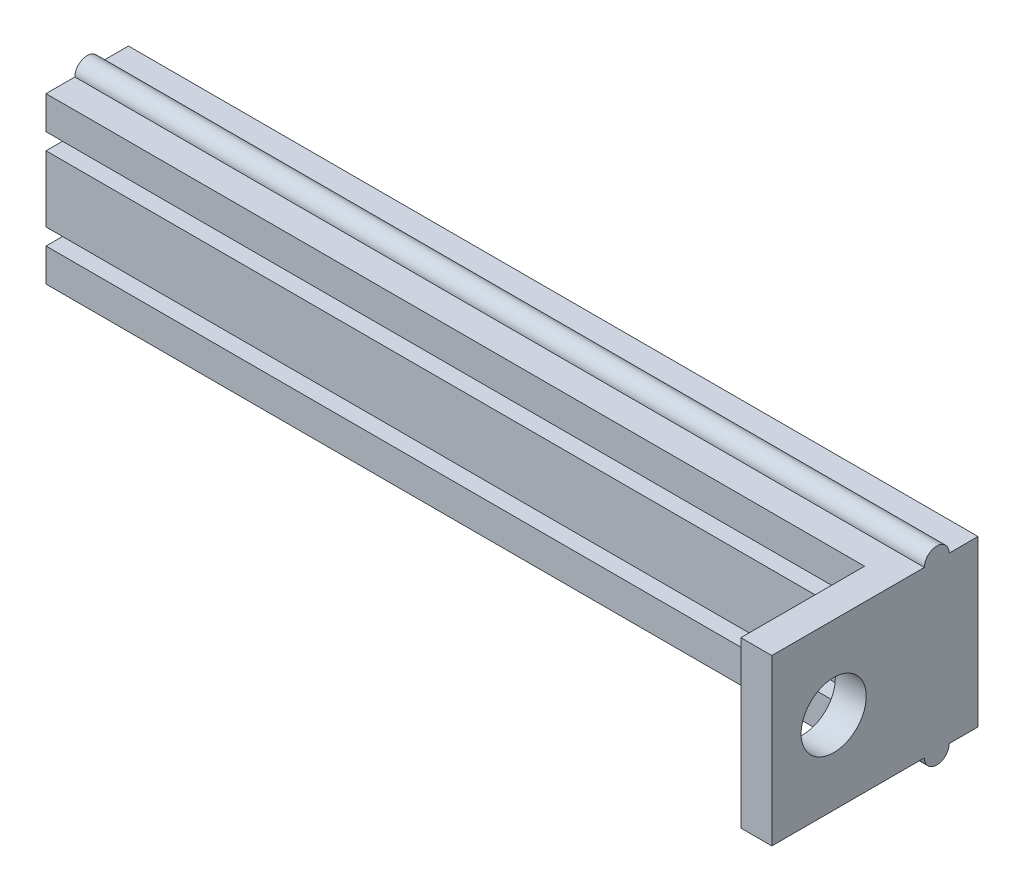
ISO-10303-21;
HEADER;
FILE_DESCRIPTION(('STEP AP214'),'2;1');
FILE_NAME('part.step','',(''),(''),'','','');
FILE_SCHEMA(('AUTOMOTIVE_DESIGN { 1 0 10303 214 1 1 1 1 }'));
ENDSEC;
DATA;
#1=APPLICATION_CONTEXT('core data for automotive mechanical design processes');
#2=APPLICATION_PROTOCOL_DEFINITION('international standard','automotive_design',2000,#1);
#3=PRODUCT_CONTEXT('',#1,'mechanical');
#4=PRODUCT('Part','Part','',(#3));
#5=PRODUCT_RELATED_PRODUCT_CATEGORY('part','',(#4));
#6=PRODUCT_DEFINITION_FORMATION('','',#4);
#7=PRODUCT_DEFINITION_CONTEXT('part definition',#1,'design');
#8=PRODUCT_DEFINITION('design','',#6,#7);
#9=PRODUCT_DEFINITION_SHAPE('','',#8);
#10=(LENGTH_UNIT() NAMED_UNIT(*) SI_UNIT(.MILLI.,.METRE.));
#11=(NAMED_UNIT(*) PLANE_ANGLE_UNIT() SI_UNIT($,.RADIAN.));
#12=(NAMED_UNIT(*) SI_UNIT($,.STERADIAN.) SOLID_ANGLE_UNIT());
#13=UNCERTAINTY_MEASURE_WITH_UNIT(LENGTH_MEASURE(1.E-05),#10,'distance_accuracy_value','');
#14=(GEOMETRIC_REPRESENTATION_CONTEXT(3) GLOBAL_UNCERTAINTY_ASSIGNED_CONTEXT((#13)) GLOBAL_UNIT_ASSIGNED_CONTEXT((#10,
#11,#12)) REPRESENTATION_CONTEXT('',''));
#15=CARTESIAN_POINT('',(0.,0.,0.));
#16=DIRECTION('',(0.,0.,1.));
#17=DIRECTION('',(1.,0.,0.));
#18=AXIS2_PLACEMENT_3D('',#15,#16,#17);
#19=CARTESIAN_POINT('',(0.,0.,20.));
#20=DIRECTION('',(0.,0.,1.));
#21=DIRECTION('',(1.,0.,0.));
#22=AXIS2_PLACEMENT_3D('',#19,#20,#21);
#23=PLANE('',#22);
#24=DIRECTION('',(0.,-1.,0.));
#25=VECTOR('',#24,1.);
#26=CARTESIAN_POINT('',(95.1247723132969,68.6666666666667,20.));
#27=LINE('',#26,#25);
#28=CARTESIAN_POINT('',(95.1247723132969,56.6666666666666,20.));
#29=VERTEX_POINT('',#28);
#30=CARTESIAN_POINT('',(95.124772313297,40.6666666666666,20.));
#31=VERTEX_POINT('',#30);
#32=EDGE_CURVE('E430',#29,#31,#27,.T.);
#33=ORIENTED_EDGE('',*,*,#32,.F.);
#34=DIRECTION('',(-1.,0.,0.));
#35=VECTOR('',#34,1.);
#36=CARTESIAN_POINT('',(95.124772313297,56.6666666666666,20.));
#37=LINE('',#36,#35);
#38=CARTESIAN_POINT('',(-103.375227686703,56.6666666666667,20.));
#39=VERTEX_POINT('',#38);
#40=EDGE_CURVE('E293',#29,#39,#37,.T.);
#41=ORIENTED_EDGE('',*,*,#40,.T.);
#42=DIRECTION('',(0.,-1.,0.));
#43=VECTOR('',#42,1.);
#44=CARTESIAN_POINT('',(-103.375227686703,68.6666666666667,20.));
#45=LINE('',#44,#43);
#46=CARTESIAN_POINT('',(-103.375227686703,40.6666666666667,20.));
#47=VERTEX_POINT('',#46);
#48=EDGE_CURVE('E444',#39,#47,#45,.T.);
#49=ORIENTED_EDGE('',*,*,#48,.T.);
#50=DIRECTION('',(-1.,0.,0.));
#51=VECTOR('',#50,1.);
#52=CARTESIAN_POINT('',(95.124772313297,40.6666666666666,20.));
#53=LINE('',#52,#51);
#54=EDGE_CURVE('E375',#31,#47,#53,.T.);
#55=ORIENTED_EDGE('',*,*,#54,.F.);
#56=EDGE_LOOP('',(#33,#41,#49,#55));
#57=FACE_BOUND('',#56,.T.);
#58=ADVANCED_FACE('F42',(#57),#23,.T.);
#59=CARTESIAN_POINT('',(95.124772313297,36.6666666666666,20.));
#60=VERTEX_POINT('',#59);
#61=CARTESIAN_POINT('',(95.124772313297,28.6666666666666,20.));
#62=VERTEX_POINT('',#61);
#63=EDGE_CURVE('E409',#60,#62,#27,.T.);
#64=ORIENTED_EDGE('',*,*,#63,.F.);
#65=DIRECTION('',(-1.,0.,0.));
#66=VECTOR('',#65,1.);
#67=CARTESIAN_POINT('',(95.124772313297,36.6666666666666,20.));
#68=LINE('',#67,#66);
#69=CARTESIAN_POINT('',(-103.375227686703,36.6666666666666,20.));
#70=VERTEX_POINT('',#69);
#71=EDGE_CURVE('E378',#60,#70,#68,.T.);
#72=ORIENTED_EDGE('',*,*,#71,.T.);
#73=CARTESIAN_POINT('',(-103.375227686703,28.6666666666666,20.));
#74=VERTEX_POINT('',#73);
#75=EDGE_CURVE('E445',#70,#74,#45,.T.);
#76=ORIENTED_EDGE('',*,*,#75,.T.);
#77=DIRECTION('',(1.,0.,0.));
#78=VECTOR('',#77,1.);
#79=CARTESIAN_POINT('',(-103.375227686703,28.6666666666666,20.));
#80=LINE('',#79,#78);
#81=EDGE_CURVE('E443',#74,#62,#80,.T.);
#82=ORIENTED_EDGE('',*,*,#81,.T.);
#83=EDGE_LOOP('',(#64,#72,#76,#82));
#84=FACE_BOUND('',#83,.T.);
#85=ADVANCED_FACE('F515',(#84),#23,.T.);
#86=CARTESIAN_POINT('',(-103.375227686703,68.6666666666667,20.));
#87=DIRECTION('',(0.,-1.,0.));
#88=DIRECTION('',(0.,0.,-1.));
#89=AXIS2_PLACEMENT_3D('',#86,#87,#88);
#90=PLANE('',#89);
#91=DIRECTION('',(0.,0.,-1.));
#92=VECTOR('',#91,1.);
#93=CARTESIAN_POINT('',(102.624772313297,68.6666666666667,20.));
#94=LINE('',#93,#92);
#95=CARTESIAN_POINT('',(102.624772313297,68.6666666666667,50.));
#96=VERTEX_POINT('',#95);
#97=CARTESIAN_POINT('',(102.624772313297,68.6666666666666,13.));
#98=VERTEX_POINT('',#97);
#99=EDGE_CURVE('E473',#96,#98,#94,.T.);
#100=ORIENTED_EDGE('',*,*,#99,.T.);
#101=DIRECTION('',(-1.,0.,0.));
#102=VECTOR('',#101,1.);
#103=CARTESIAN_POINT('',(102.624772313297,68.6666666666666,13.));
#104=LINE('',#103,#102);
#105=CARTESIAN_POINT('',(-103.375227686703,68.6666666666667,13.));
#106=VERTEX_POINT('',#105);
#107=EDGE_CURVE('E289',#98,#106,#104,.T.);
#108=ORIENTED_EDGE('',*,*,#107,.T.);
#109=DIRECTION('',(0.,0.,-1.));
#110=VECTOR('',#109,1.);
#111=CARTESIAN_POINT('',(-103.375227686703,68.6666666666667,20.));
#112=LINE('',#111,#110);
#113=CARTESIAN_POINT('',(-103.375227686703,68.6666666666667,20.));
#114=VERTEX_POINT('',#113);
#115=EDGE_CURVE('E468',#114,#106,#112,.T.);
#116=ORIENTED_EDGE('',*,*,#115,.F.);
#117=DIRECTION('',(-1.,0.,0.));
#118=VECTOR('',#117,1.);
#119=CARTESIAN_POINT('',(-103.375227686703,68.6666666666667,20.));
#120=LINE('',#119,#118);
#121=CARTESIAN_POINT('',(95.1247723132969,68.6666666666667,20.));
#122=VERTEX_POINT('',#121);
#123=EDGE_CURVE('E449',#122,#114,#120,.T.);
#124=ORIENTED_EDGE('',*,*,#123,.F.);
#125=DIRECTION('',(0.,0.,-1.));
#126=VECTOR('',#125,1.);
#127=CARTESIAN_POINT('',(95.1247723132969,68.6666666666667,50.));
#128=LINE('',#127,#126);
#129=CARTESIAN_POINT('',(95.1247723132969,68.6666666666667,50.));
#130=VERTEX_POINT('',#129);
#131=EDGE_CURVE('E434',#130,#122,#128,.T.);
#132=ORIENTED_EDGE('',*,*,#131,.F.);
#133=DIRECTION('',(-1.,0.,0.));
#134=VECTOR('',#133,1.);
#135=CARTESIAN_POINT('',(102.624772313297,68.6666666666667,50.));
#136=LINE('',#135,#134);
#137=EDGE_CURVE('E416',#96,#130,#136,.T.);
#138=ORIENTED_EDGE('',*,*,#137,.F.);
#139=EDGE_LOOP('',(#100,#108,#116,#124,#132,#138));
#140=FACE_BOUND('',#139,.T.);
#141=ADVANCED_FACE('F526',(#140),#90,.F.);
#142=CARTESIAN_POINT('',(-103.375227686703,28.6666666666666,20.));
#143=DIRECTION('',(0.,1.,0.));
#144=DIRECTION('',(0.,0.,1.));
#145=AXIS2_PLACEMENT_3D('',#142,#143,#144);
#146=PLANE('',#145);
#147=DIRECTION('',(0.,0.,-1.));
#148=VECTOR('',#147,1.);
#149=CARTESIAN_POINT('',(102.624772313297,28.6666666666666,20.));
#150=LINE('',#149,#148);
#151=CARTESIAN_POINT('',(102.624772313297,28.6666666666666,7.));
#152=VERTEX_POINT('',#151);
#153=CARTESIAN_POINT('',(102.624772313297,28.6666666666666,0.));
#154=VERTEX_POINT('',#153);
#155=EDGE_CURVE('E476',#152,#154,#150,.T.);
#156=ORIENTED_EDGE('',*,*,#155,.F.);
#157=DIRECTION('',(-1.,0.,0.));
#158=VECTOR('',#157,1.);
#159=CARTESIAN_POINT('',(102.624772313297,28.6666666666666,7.));
#160=LINE('',#159,#158);
#161=CARTESIAN_POINT('',(-103.375227686703,28.6666666666666,7.));
#162=VERTEX_POINT('',#161);
#163=EDGE_CURVE('E405',#152,#162,#160,.T.);
#164=ORIENTED_EDGE('',*,*,#163,.T.);
#165=DIRECTION('',(0.,0.,-1.));
#166=VECTOR('',#165,1.);
#167=CARTESIAN_POINT('',(-103.375227686703,28.6666666666666,20.));
#168=LINE('',#167,#166);
#169=CARTESIAN_POINT('',(-103.375227686703,28.6666666666666,0.));
#170=VERTEX_POINT('',#169);
#171=EDGE_CURVE('E51',#162,#170,#168,.T.);
#172=ORIENTED_EDGE('',*,*,#171,.T.);
#173=DIRECTION('',(1.,0.,0.));
#174=VECTOR('',#173,1.);
#175=CARTESIAN_POINT('',(-103.375227686703,28.6666666666666,0.));
#176=LINE('',#175,#174);
#177=EDGE_CURVE('E456',#170,#154,#176,.T.);
#178=ORIENTED_EDGE('',*,*,#177,.T.);
#179=EDGE_LOOP('',(#156,#164,#172,#178));
#180=FACE_BOUND('',#179,.T.);
#181=ADVANCED_FACE('F492',(#180),#146,.F.);
#182=CARTESIAN_POINT('',(-103.375227686703,68.6666666666667,20.));
#183=DIRECTION('',(1.,0.,0.));
#184=DIRECTION('',(0.,1.,0.));
#185=AXIS2_PLACEMENT_3D('',#182,#183,#184);
#186=PLANE('',#185);
#187=DIRECTION('',(0.,-1.,0.));
#188=VECTOR('',#187,1.);
#189=CARTESIAN_POINT('',(-103.375227686703,0.,15.));
#190=LINE('',#189,#188);
#191=CARTESIAN_POINT('',(-103.375227686703,63.6666666666667,15.));
#192=VERTEX_POINT('',#191);
#193=CARTESIAN_POINT('',(-103.375227686703,60.6666666666666,15.));
#194=VERTEX_POINT('',#193);
#195=EDGE_CURVE('E233',#192,#194,#190,.T.);
#196=ORIENTED_EDGE('',*,*,#195,.T.);
#197=DIRECTION('',(0.,0.,-1.));
#198=VECTOR('',#197,1.);
#199=CARTESIAN_POINT('',(-103.375227686703,60.6666666666666,0.));
#200=LINE('',#199,#198);
#201=CARTESIAN_POINT('',(-103.375227686703,60.6666666666666,20.));
#202=VERTEX_POINT('',#201);
#203=EDGE_CURVE('E242',#202,#194,#200,.T.);
#204=ORIENTED_EDGE('',*,*,#203,.F.);
#205=EDGE_CURVE('E439',#114,#202,#45,.T.);
#206=ORIENTED_EDGE('',*,*,#205,.F.);
#207=ORIENTED_EDGE('',*,*,#115,.T.);
#208=CARTESIAN_POINT('',(-103.375227686703,68.6666666666667,10.));
#209=DIRECTION('',(-1.,0.,0.));
#210=DIRECTION('',(0.,-1.,0.));
#211=AXIS2_PLACEMENT_3D('',#208,#209,#210);
#212=CIRCLE('',#211,3.);
#213=CARTESIAN_POINT('',(-103.375227686703,68.6666666666667,7.));
#214=VERTEX_POINT('',#213);
#215=EDGE_CURVE('E392',#106,#214,#212,.T.);
#216=ORIENTED_EDGE('',*,*,#215,.T.);
#217=CARTESIAN_POINT('',(-103.375227686703,68.6666666666667,0.));
#218=VERTEX_POINT('',#217);
#219=EDGE_CURVE('E452',#214,#218,#112,.T.);
#220=ORIENTED_EDGE('',*,*,#219,.T.);
#221=DIRECTION('',(0.,-1.,0.));
#222=VECTOR('',#221,1.);
#223=CARTESIAN_POINT('',(-103.375227686703,68.6666666666667,0.));
#224=LINE('',#223,#222);
#225=EDGE_CURVE('E438',#218,#170,#224,.T.);
#226=ORIENTED_EDGE('',*,*,#225,.T.);
#227=ORIENTED_EDGE('',*,*,#171,.F.);
#228=CARTESIAN_POINT('',(-103.375227686703,28.6666666666666,10.));
#229=DIRECTION('',(-1.,0.,0.));
#230=DIRECTION('',(0.,-1.,0.));
#231=AXIS2_PLACEMENT_3D('',#228,#229,#230);
#232=CIRCLE('',#231,3.);
#233=CARTESIAN_POINT('',(-103.375227686703,28.6666666666666,13.));
#234=VERTEX_POINT('',#233);
#235=EDGE_CURVE('E395',#162,#234,#232,.T.);
#236=ORIENTED_EDGE('',*,*,#235,.T.);
#237=EDGE_CURVE('E11',#74,#234,#168,.T.);
#238=ORIENTED_EDGE('',*,*,#237,.F.);
#239=ORIENTED_EDGE('',*,*,#75,.F.);
#240=DIRECTION('',(0.,0.,-1.));
#241=VECTOR('',#240,1.);
#242=CARTESIAN_POINT('',(-103.375227686703,36.6666666666666,0.));
#243=LINE('',#242,#241);
#244=CARTESIAN_POINT('',(-103.375227686703,36.6666666666666,15.));
#245=VERTEX_POINT('',#244);
#246=EDGE_CURVE('E337',#70,#245,#243,.T.);
#247=ORIENTED_EDGE('',*,*,#246,.T.);
#248=DIRECTION('',(0.,-1.,0.));
#249=VECTOR('',#248,1.);
#250=CARTESIAN_POINT('',(-103.375227686703,0.,15.));
#251=LINE('',#250,#249);
#252=CARTESIAN_POINT('',(-103.375227686703,33.6666666666667,15.));
#253=VERTEX_POINT('',#252);
#254=EDGE_CURVE('E333',#245,#253,#251,.T.);
#255=ORIENTED_EDGE('',*,*,#254,.T.);
#256=DIRECTION('',(0.,0.,1.));
#257=VECTOR('',#256,1.);
#258=CARTESIAN_POINT('',(-103.375227686703,33.6666666666667,0.));
#259=LINE('',#258,#257);
#260=CARTESIAN_POINT('',(-103.375227686703,33.6666666666667,10.));
#261=VERTEX_POINT('',#260);
#262=EDGE_CURVE('E311',#261,#253,#259,.T.);
#263=ORIENTED_EDGE('',*,*,#262,.F.);
#264=DIRECTION('',(0.,-1.,0.));
#265=VECTOR('',#264,1.);
#266=CARTESIAN_POINT('',(-103.375227686703,0.,10.));
#267=LINE('',#266,#265);
#268=CARTESIAN_POINT('',(-103.375227686703,43.6666666666667,10.));
#269=VERTEX_POINT('',#268);
#270=EDGE_CURVE('E354',#269,#261,#267,.T.);
#271=ORIENTED_EDGE('',*,*,#270,.F.);
#272=DIRECTION('',(0.,0.,1.));
#273=VECTOR('',#272,1.);
#274=CARTESIAN_POINT('',(-103.375227686703,43.6666666666667,0.));
#275=LINE('',#274,#273);
#276=CARTESIAN_POINT('',(-103.375227686703,43.6666666666667,15.));
#277=VERTEX_POINT('',#276);
#278=EDGE_CURVE('E350',#269,#277,#275,.T.);
#279=ORIENTED_EDGE('',*,*,#278,.T.);
#280=DIRECTION('',(0.,-1.,0.));
#281=VECTOR('',#280,1.);
#282=CARTESIAN_POINT('',(-103.375227686703,0.,15.));
#283=LINE('',#282,#281);
#284=CARTESIAN_POINT('',(-103.375227686703,40.6666666666667,15.));
#285=VERTEX_POINT('',#284);
#286=EDGE_CURVE('E346',#277,#285,#283,.T.);
#287=ORIENTED_EDGE('',*,*,#286,.T.);
#288=DIRECTION('',(0.,0.,-1.));
#289=VECTOR('',#288,1.);
#290=CARTESIAN_POINT('',(-103.375227686703,40.6666666666667,0.));
#291=LINE('',#290,#289);
#292=EDGE_CURVE('E342',#47,#285,#291,.T.);
#293=ORIENTED_EDGE('',*,*,#292,.F.);
#294=ORIENTED_EDGE('',*,*,#48,.F.);
#295=DIRECTION('',(0.,0.,-1.));
#296=VECTOR('',#295,1.);
#297=CARTESIAN_POINT('',(-103.375227686703,56.6666666666667,0.));
#298=LINE('',#297,#296);
#299=CARTESIAN_POINT('',(-103.375227686703,56.6666666666667,15.));
#300=VERTEX_POINT('',#299);
#301=EDGE_CURVE('E246',#39,#300,#298,.T.);
#302=ORIENTED_EDGE('',*,*,#301,.T.);
#303=DIRECTION('',(0.,-1.,0.));
#304=VECTOR('',#303,1.);
#305=CARTESIAN_POINT('',(-103.375227686703,0.,15.));
#306=LINE('',#305,#304);
#307=CARTESIAN_POINT('',(-103.375227686703,53.6666666666666,15.));
#308=VERTEX_POINT('',#307);
#309=EDGE_CURVE('E279',#300,#308,#306,.T.);
#310=ORIENTED_EDGE('',*,*,#309,.T.);
#311=DIRECTION('',(0.,0.,1.));
#312=VECTOR('',#311,1.);
#313=CARTESIAN_POINT('',(-103.375227686703,53.6666666666666,0.));
#314=LINE('',#313,#312);
#315=CARTESIAN_POINT('',(-103.375227686703,53.6666666666666,10.));
#316=VERTEX_POINT('',#315);
#317=EDGE_CURVE('E275',#316,#308,#314,.T.);
#318=ORIENTED_EDGE('',*,*,#317,.F.);
#319=DIRECTION('',(0.,-1.,0.));
#320=VECTOR('',#319,1.);
#321=CARTESIAN_POINT('',(-103.375227686703,0.,10.));
#322=LINE('',#321,#320);
#323=CARTESIAN_POINT('',(-103.375227686703,63.6666666666667,10.));
#324=VERTEX_POINT('',#323);
#325=EDGE_CURVE('E271',#324,#316,#322,.T.);
#326=ORIENTED_EDGE('',*,*,#325,.F.);
#327=DIRECTION('',(0.,0.,1.));
#328=VECTOR('',#327,1.);
#329=CARTESIAN_POINT('',(-103.375227686703,63.6666666666667,0.));
#330=LINE('',#329,#328);
#331=EDGE_CURVE('E267',#324,#192,#330,.T.);
#332=ORIENTED_EDGE('',*,*,#331,.T.);
#333=EDGE_LOOP('',(#196,#204,#206,#207,#216,#220,#226,#227,#236,#238,#239,#247,#255,#263,#271,
#279,#287,#293,#294,#302,#310,#318,#326,#332));
#334=FACE_BOUND('',#333,.T.);
#335=ADVANCED_FACE('F44',(#334),#186,.F.);
#336=ORIENTED_EDGE('',*,*,#237,.T.);
#337=DIRECTION('',(-1.,0.,0.));
#338=VECTOR('',#337,1.);
#339=CARTESIAN_POINT('',(102.624772313297,28.6666666666666,13.));
#340=LINE('',#339,#338);
#341=CARTESIAN_POINT('',(102.624772313297,28.6666666666666,13.));
#342=VERTEX_POINT('',#341);
#343=EDGE_CURVE('E401',#342,#234,#340,.T.);
#344=ORIENTED_EDGE('',*,*,#343,.F.);
#345=CARTESIAN_POINT('',(102.624772313297,28.6666666666666,50.));
#346=VERTEX_POINT('',#345);
#347=EDGE_CURVE('E477',#346,#342,#150,.T.);
#348=ORIENTED_EDGE('',*,*,#347,.F.);
#349=DIRECTION('',(1.,0.,0.));
#350=VECTOR('',#349,1.);
#351=CARTESIAN_POINT('',(102.624772313297,28.6666666666666,50.));
#352=LINE('',#351,#350);
#353=CARTESIAN_POINT('',(95.124772313297,28.6666666666666,50.));
#354=VERTEX_POINT('',#353);
#355=EDGE_CURVE('E423',#354,#346,#352,.T.);
#356=ORIENTED_EDGE('',*,*,#355,.F.);
#357=DIRECTION('',(0.,0.,-1.));
#358=VECTOR('',#357,1.);
#359=CARTESIAN_POINT('',(95.124772313297,28.6666666666666,50.));
#360=LINE('',#359,#358);
#361=EDGE_CURVE('E427',#354,#62,#360,.T.);
#362=ORIENTED_EDGE('',*,*,#361,.T.);
#363=ORIENTED_EDGE('',*,*,#81,.F.);
#364=EDGE_LOOP('',(#336,#344,#348,#356,#362,#363));
#365=FACE_BOUND('',#364,.T.);
#366=ADVANCED_FACE('F519',(#365),#146,.F.);
#367=CARTESIAN_POINT('',(102.624772313297,68.6666666666667,20.));
#368=DIRECTION('',(-1.,0.,0.));
#369=DIRECTION('',(0.,-1.,0.));
#370=AXIS2_PLACEMENT_3D('',#367,#368,#369);
#371=PLANE('',#370);
#372=CARTESIAN_POINT('',(102.624772313297,48.6666666666666,35.));
#373=DIRECTION('',(-1.,0.,0.));
#374=DIRECTION('',(0.,-1.,0.));
#375=AXIS2_PLACEMENT_3D('',#372,#373,#374);
#376=CIRCLE('',#375,7.9);
#377=CARTESIAN_POINT('',(102.624772313297,40.7666666666666,35.));
#378=VERTEX_POINT('',#377);
#379=EDGE_CURVE('E338',#378,#378,#376,.T.);
#380=ORIENTED_EDGE('',*,*,#379,.T.);
#381=EDGE_LOOP('',(#380));
#382=FACE_BOUND('',#381,.T.);
#383=DIRECTION('',(0.,1.,0.));
#384=VECTOR('',#383,1.);
#385=CARTESIAN_POINT('',(102.624772313297,68.6666666666667,0.));
#386=LINE('',#385,#384);
#387=CARTESIAN_POINT('',(102.624772313297,68.6666666666667,0.));
#388=VERTEX_POINT('',#387);
#389=EDGE_CURVE('E460',#154,#388,#386,.T.);
#390=ORIENTED_EDGE('',*,*,#389,.T.);
#391=CARTESIAN_POINT('',(102.624772313297,68.6666666666666,7.));
#392=VERTEX_POINT('',#391);
#393=EDGE_CURVE('E472',#392,#388,#94,.T.);
#394=ORIENTED_EDGE('',*,*,#393,.F.);
#395=CARTESIAN_POINT('',(102.624772313297,68.6666666666666,10.));
#396=DIRECTION('',(-1.,0.,0.));
#397=DIRECTION('',(0.,-1.,0.));
#398=AXIS2_PLACEMENT_3D('',#395,#396,#397);
#399=CIRCLE('',#398,3.);
#400=EDGE_CURVE('E388',#98,#392,#399,.T.);
#401=ORIENTED_EDGE('',*,*,#400,.F.);
#402=ORIENTED_EDGE('',*,*,#99,.F.);
#403=DIRECTION('',(0.,1.,0.));
#404=VECTOR('',#403,1.);
#405=CARTESIAN_POINT('',(102.624772313297,68.6666666666667,50.));
#406=LINE('',#405,#404);
#407=EDGE_CURVE('E412',#346,#96,#406,.T.);
#408=ORIENTED_EDGE('',*,*,#407,.F.);
#409=ORIENTED_EDGE('',*,*,#347,.T.);
#410=CARTESIAN_POINT('',(102.624772313297,28.6666666666666,10.));
#411=DIRECTION('',(-1.,0.,0.));
#412=DIRECTION('',(0.,-1.,0.));
#413=AXIS2_PLACEMENT_3D('',#410,#411,#412);
#414=CIRCLE('',#413,3.);
#415=EDGE_CURVE('E398',#152,#342,#414,.T.);
#416=ORIENTED_EDGE('',*,*,#415,.F.);
#417=ORIENTED_EDGE('',*,*,#155,.T.);
#418=EDGE_LOOP('',(#390,#394,#401,#402,#408,#409,#416,#417));
#419=FACE_BOUND('',#418,.T.);
#420=ADVANCED_FACE('F485',(#382,#419),#371,.F.);
#421=ORIENTED_EDGE('',*,*,#219,.F.);
#422=DIRECTION('',(-1.,0.,0.));
#423=VECTOR('',#422,1.);
#424=CARTESIAN_POINT('',(102.624772313297,68.6666666666666,7.));
#425=LINE('',#424,#423);
#426=EDGE_CURVE('E384',#392,#214,#425,.T.);
#427=ORIENTED_EDGE('',*,*,#426,.F.);
#428=ORIENTED_EDGE('',*,*,#393,.T.);
#429=DIRECTION('',(-1.,0.,0.));
#430=VECTOR('',#429,1.);
#431=CARTESIAN_POINT('',(-103.375227686703,68.6666666666667,0.));
#432=LINE('',#431,#430);
#433=EDGE_CURVE('E464',#388,#218,#432,.T.);
#434=ORIENTED_EDGE('',*,*,#433,.T.);
#435=EDGE_LOOP('',(#421,#427,#428,#434));
#436=FACE_BOUND('',#435,.T.);
#437=ADVANCED_FACE('F499',(#436),#90,.F.);
#438=DIRECTION('',(-1.,0.,0.));
#439=VECTOR('',#438,1.);
#440=CARTESIAN_POINT('',(95.124772313297,60.6666666666666,20.));
#441=LINE('',#440,#439);
#442=CARTESIAN_POINT('',(95.124772313297,60.6666666666666,20.));
#443=VERTEX_POINT('',#442);
#444=EDGE_CURVE('E290',#443,#202,#441,.T.);
#445=ORIENTED_EDGE('',*,*,#444,.F.);
#446=EDGE_CURVE('E417',#122,#443,#27,.T.);
#447=ORIENTED_EDGE('',*,*,#446,.F.);
#448=ORIENTED_EDGE('',*,*,#123,.T.);
#449=ORIENTED_EDGE('',*,*,#205,.T.);
#450=EDGE_LOOP('',(#445,#447,#448,#449));
#451=FACE_BOUND('',#450,.T.);
#452=ADVANCED_FACE('F531',(#451),#23,.T.);
#453=CARTESIAN_POINT('',(0.,0.,0.));
#454=DIRECTION('',(0.,0.,1.));
#455=DIRECTION('',(1.,0.,0.));
#456=AXIS2_PLACEMENT_3D('',#453,#454,#455);
#457=PLANE('',#456);
#458=ORIENTED_EDGE('',*,*,#225,.F.);
#459=ORIENTED_EDGE('',*,*,#433,.F.);
#460=ORIENTED_EDGE('',*,*,#389,.F.);
#461=ORIENTED_EDGE('',*,*,#177,.F.);
#462=EDGE_LOOP('',(#458,#459,#460,#461));
#463=FACE_BOUND('',#462,.T.);
#464=ADVANCED_FACE('F496',(#463),#457,.F.);
#465=CARTESIAN_POINT('',(95.1247723132969,68.6666666666667,50.));
#466=DIRECTION('',(1.,0.,0.));
#467=DIRECTION('',(0.,1.,0.));
#468=AXIS2_PLACEMENT_3D('',#465,#466,#467);
#469=PLANE('',#468);
#470=CARTESIAN_POINT('',(95.124772313297,48.6666666666666,35.));
#471=DIRECTION('',(-1.,0.,0.));
#472=DIRECTION('',(0.,-1.,0.));
#473=AXIS2_PLACEMENT_3D('',#470,#471,#472);
#474=CIRCLE('',#473,7.9);
#475=CARTESIAN_POINT('',(95.124772313297,40.7666666666666,35.));
#476=VERTEX_POINT('',#475);
#477=EDGE_CURVE('E249',#476,#476,#474,.T.);
#478=ORIENTED_EDGE('',*,*,#477,.F.);
#479=EDGE_LOOP('',(#478));
#480=FACE_BOUND('',#479,.T.);
#481=ORIENTED_EDGE('',*,*,#446,.T.);
#482=DIRECTION('',(0.,0.,-1.));
#483=VECTOR('',#482,1.);
#484=CARTESIAN_POINT('',(95.124772313297,60.6666666666666,0.));
#485=LINE('',#484,#483);
#486=CARTESIAN_POINT('',(95.124772313297,60.6666666666666,15.));
#487=VERTEX_POINT('',#486);
#488=EDGE_CURVE('E236',#443,#487,#485,.T.);
#489=ORIENTED_EDGE('',*,*,#488,.T.);
#490=DIRECTION('',(0.,-1.,0.));
#491=VECTOR('',#490,1.);
#492=CARTESIAN_POINT('',(95.1247723132969,0.,15.));
#493=LINE('',#492,#491);
#494=CARTESIAN_POINT('',(95.124772313297,63.6666666666666,15.));
#495=VERTEX_POINT('',#494);
#496=EDGE_CURVE('E227',#495,#487,#493,.T.);
#497=ORIENTED_EDGE('',*,*,#496,.F.);
#498=DIRECTION('',(0.,0.,1.));
#499=VECTOR('',#498,1.);
#500=CARTESIAN_POINT('',(95.124772313297,63.6666666666666,0.));
#501=LINE('',#500,#499);
#502=CARTESIAN_POINT('',(95.124772313297,63.6666666666666,10.));
#503=VERTEX_POINT('',#502);
#504=EDGE_CURVE('E215',#503,#495,#501,.T.);
#505=ORIENTED_EDGE('',*,*,#504,.F.);
#506=DIRECTION('',(0.,-1.,0.));
#507=VECTOR('',#506,1.);
#508=CARTESIAN_POINT('',(95.1247723132969,0.,10.));
#509=LINE('',#508,#507);
#510=CARTESIAN_POINT('',(95.124772313297,53.6666666666666,10.));
#511=VERTEX_POINT('',#510);
#512=EDGE_CURVE('E226',#503,#511,#509,.T.);
#513=ORIENTED_EDGE('',*,*,#512,.T.);
#514=DIRECTION('',(0.,0.,1.));
#515=VECTOR('',#514,1.);
#516=CARTESIAN_POINT('',(95.124772313297,53.6666666666666,0.));
#517=LINE('',#516,#515);
#518=CARTESIAN_POINT('',(95.124772313297,53.6666666666666,15.));
#519=VERTEX_POINT('',#518);
#520=EDGE_CURVE('E254',#511,#519,#517,.T.);
#521=ORIENTED_EDGE('',*,*,#520,.T.);
#522=DIRECTION('',(0.,-1.,0.));
#523=VECTOR('',#522,1.);
#524=CARTESIAN_POINT('',(95.1247723132969,0.,15.));
#525=LINE('',#524,#523);
#526=CARTESIAN_POINT('',(95.124772313297,56.6666666666666,15.));
#527=VERTEX_POINT('',#526);
#528=EDGE_CURVE('E258',#527,#519,#525,.T.);
#529=ORIENTED_EDGE('',*,*,#528,.F.);
#530=DIRECTION('',(0.,0.,-1.));
#531=VECTOR('',#530,1.);
#532=CARTESIAN_POINT('',(95.124772313297,56.6666666666666,0.));
#533=LINE('',#532,#531);
#534=EDGE_CURVE('E65',#29,#527,#533,.T.);
#535=ORIENTED_EDGE('',*,*,#534,.F.);
#536=ORIENTED_EDGE('',*,*,#32,.T.);
#537=DIRECTION('',(0.,0.,-1.));
#538=VECTOR('',#537,1.);
#539=CARTESIAN_POINT('',(95.124772313297,40.6666666666666,0.));
#540=LINE('',#539,#538);
#541=CARTESIAN_POINT('',(95.124772313297,40.6666666666666,15.));
#542=VERTEX_POINT('',#541);
#543=EDGE_CURVE('E314',#31,#542,#540,.T.);
#544=ORIENTED_EDGE('',*,*,#543,.T.);
#545=DIRECTION('',(0.,-1.,0.));
#546=VECTOR('',#545,1.);
#547=CARTESIAN_POINT('',(95.1247723132969,0.,15.));
#548=LINE('',#547,#546);
#549=CARTESIAN_POINT('',(95.124772313297,43.6666666666666,15.));
#550=VERTEX_POINT('',#549);
#551=EDGE_CURVE('E318',#550,#542,#548,.T.);
#552=ORIENTED_EDGE('',*,*,#551,.F.);
#553=DIRECTION('',(0.,0.,1.));
#554=VECTOR('',#553,1.);
#555=CARTESIAN_POINT('',(95.124772313297,43.6666666666666,0.));
#556=LINE('',#555,#554);
#557=CARTESIAN_POINT('',(95.124772313297,43.6666666666666,10.));
#558=VERTEX_POINT('',#557);
#559=EDGE_CURVE('E321',#558,#550,#556,.T.);
#560=ORIENTED_EDGE('',*,*,#559,.F.);
#561=DIRECTION('',(0.,-1.,0.));
#562=VECTOR('',#561,1.);
#563=CARTESIAN_POINT('',(95.1247723132969,0.,10.));
#564=LINE('',#563,#562);
#565=CARTESIAN_POINT('',(95.124772313297,33.6666666666666,10.));
#566=VERTEX_POINT('',#565);
#567=EDGE_CURVE('E324',#558,#566,#564,.T.);
#568=ORIENTED_EDGE('',*,*,#567,.T.);
#569=DIRECTION('',(0.,0.,1.));
#570=VECTOR('',#569,1.);
#571=CARTESIAN_POINT('',(95.124772313297,33.6666666666666,0.));
#572=LINE('',#571,#570);
#573=CARTESIAN_POINT('',(95.124772313297,33.6666666666666,15.));
#574=VERTEX_POINT('',#573);
#575=EDGE_CURVE('E328',#566,#574,#572,.T.);
#576=ORIENTED_EDGE('',*,*,#575,.T.);
#577=DIRECTION('',(0.,-1.,0.));
#578=VECTOR('',#577,1.);
#579=CARTESIAN_POINT('',(95.1247723132969,0.,15.));
#580=LINE('',#579,#578);
#581=CARTESIAN_POINT('',(95.124772313297,36.6666666666666,15.));
#582=VERTEX_POINT('',#581);
#583=EDGE_CURVE('E308',#582,#574,#580,.T.);
#584=ORIENTED_EDGE('',*,*,#583,.F.);
#585=DIRECTION('',(0.,0.,-1.));
#586=VECTOR('',#585,1.);
#587=CARTESIAN_POINT('',(95.124772313297,36.6666666666666,0.));
#588=LINE('',#587,#586);
#589=EDGE_CURVE('E58',#60,#582,#588,.T.);
#590=ORIENTED_EDGE('',*,*,#589,.F.);
#591=ORIENTED_EDGE('',*,*,#63,.T.);
#592=ORIENTED_EDGE('',*,*,#361,.F.);
#593=DIRECTION('',(0.,-1.,0.));
#594=VECTOR('',#593,1.);
#595=CARTESIAN_POINT('',(95.1247723132969,68.6666666666667,50.));
#596=LINE('',#595,#594);
#597=EDGE_CURVE('E420',#130,#354,#596,.T.);
#598=ORIENTED_EDGE('',*,*,#597,.F.);
#599=ORIENTED_EDGE('',*,*,#131,.T.);
#600=EDGE_LOOP('',(#481,#489,#497,#505,#513,#521,#529,#535,#536,#544,#552,#560,#568,#576,#584,
#590,#591,#592,#598,#599));
#601=FACE_BOUND('',#600,.T.);
#602=ADVANCED_FACE('F240',(#480,#601),#469,.F.);
#603=CARTESIAN_POINT('',(0.,0.,50.));
#604=DIRECTION('',(0.,0.,-1.));
#605=DIRECTION('',(-1.,0.,0.));
#606=AXIS2_PLACEMENT_3D('',#603,#604,#605);
#607=PLANE('',#606);
#608=ORIENTED_EDGE('',*,*,#407,.T.);
#609=ORIENTED_EDGE('',*,*,#137,.T.);
#610=ORIENTED_EDGE('',*,*,#597,.T.);
#611=ORIENTED_EDGE('',*,*,#355,.T.);
#612=EDGE_LOOP('',(#608,#609,#610,#611));
#613=FACE_BOUND('',#612,.T.);
#614=ADVANCED_FACE('F522',(#613),#607,.F.);
#615=CARTESIAN_POINT('',(102.624772313297,28.6666666666666,10.));
#616=DIRECTION('',(-1.,0.,0.));
#617=DIRECTION('',(0.,-1.,0.));
#618=AXIS2_PLACEMENT_3D('',#615,#616,#617);
#619=CYLINDRICAL_SURFACE('',#618,3.);
#620=ORIENTED_EDGE('',*,*,#235,.F.);
#621=ORIENTED_EDGE('',*,*,#163,.F.);
#622=ORIENTED_EDGE('',*,*,#415,.T.);
#623=ORIENTED_EDGE('',*,*,#343,.T.);
#624=EDGE_LOOP('',(#620,#621,#622,#623));
#625=FACE_BOUND('',#624,.T.);
#626=ADVANCED_FACE('F584',(#625),#619,.T.);
#627=CARTESIAN_POINT('',(102.624772313297,68.6666666666666,10.));
#628=DIRECTION('',(-1.,0.,0.));
#629=DIRECTION('',(0.,-1.,0.));
#630=AXIS2_PLACEMENT_3D('',#627,#628,#629);
#631=CYLINDRICAL_SURFACE('',#630,3.);
#632=ORIENTED_EDGE('',*,*,#215,.F.);
#633=ORIENTED_EDGE('',*,*,#107,.F.);
#634=ORIENTED_EDGE('',*,*,#400,.T.);
#635=ORIENTED_EDGE('',*,*,#426,.T.);
#636=EDGE_LOOP('',(#632,#633,#634,#635));
#637=FACE_BOUND('',#636,.T.);
#638=ADVANCED_FACE('F586',(#637),#631,.T.);
#639=CARTESIAN_POINT('',(95.1247723132969,0.,15.));
#640=DIRECTION('',(0.,0.,-1.));
#641=DIRECTION('',(-1.,0.,0.));
#642=AXIS2_PLACEMENT_3D('',#639,#640,#641);
#643=PLANE('',#642);
#644=ORIENTED_EDGE('',*,*,#254,.F.);
#645=DIRECTION('',(-1.,0.,0.));
#646=VECTOR('',#645,1.);
#647=CARTESIAN_POINT('',(95.124772313297,36.6666666666666,15.));
#648=LINE('',#647,#646);
#649=EDGE_CURVE('E332',#582,#245,#648,.T.);
#650=ORIENTED_EDGE('',*,*,#649,.F.);
#651=ORIENTED_EDGE('',*,*,#583,.T.);
#652=DIRECTION('',(-1.,0.,0.));
#653=VECTOR('',#652,1.);
#654=CARTESIAN_POINT('',(95.124772313297,33.6666666666666,15.));
#655=LINE('',#654,#653);
#656=EDGE_CURVE('E268',#574,#253,#655,.T.);
#657=ORIENTED_EDGE('',*,*,#656,.T.);
#658=EDGE_LOOP('',(#644,#650,#651,#657));
#659=FACE_BOUND('',#658,.T.);
#660=ADVANCED_FACE('F580',(#659),#643,.T.);
#661=CARTESIAN_POINT('',(95.124772313297,33.6666666666666,0.));
#662=DIRECTION('',(0.,-1.,0.));
#663=DIRECTION('',(1.,0.,0.));
#664=AXIS2_PLACEMENT_3D('',#661,#662,#663);
#665=PLANE('',#664);
#666=ORIENTED_EDGE('',*,*,#262,.T.);
#667=ORIENTED_EDGE('',*,*,#656,.F.);
#668=ORIENTED_EDGE('',*,*,#575,.F.);
#669=DIRECTION('',(-1.,0.,0.));
#670=VECTOR('',#669,1.);
#671=CARTESIAN_POINT('',(95.124772313297,33.6666666666666,10.));
#672=LINE('',#671,#670);
#673=EDGE_CURVE('E363',#566,#261,#672,.T.);
#674=ORIENTED_EDGE('',*,*,#673,.T.);
#675=EDGE_LOOP('',(#666,#667,#668,#674));
#676=FACE_BOUND('',#675,.T.);
#677=ADVANCED_FACE('F575',(#676),#665,.F.);
#678=CARTESIAN_POINT('',(95.1247723132969,0.,10.));
#679=DIRECTION('',(0.,0.,-1.));
#680=DIRECTION('',(0.,1.,0.));
#681=AXIS2_PLACEMENT_3D('',#678,#679,#680);
#682=PLANE('',#681);
#683=ORIENTED_EDGE('',*,*,#270,.T.);
#684=ORIENTED_EDGE('',*,*,#673,.F.);
#685=ORIENTED_EDGE('',*,*,#567,.F.);
#686=DIRECTION('',(-1.,0.,0.));
#687=VECTOR('',#686,1.);
#688=CARTESIAN_POINT('',(95.124772313297,43.6666666666666,10.));
#689=LINE('',#688,#687);
#690=EDGE_CURVE('E366',#558,#269,#689,.T.);
#691=ORIENTED_EDGE('',*,*,#690,.T.);
#692=EDGE_LOOP('',(#683,#684,#685,#691));
#693=FACE_BOUND('',#692,.T.);
#694=ADVANCED_FACE('F572',(#693),#682,.F.);
#695=CARTESIAN_POINT('',(95.124772313297,43.6666666666666,0.));
#696=DIRECTION('',(0.,-1.,0.));
#697=DIRECTION('',(1.,0.,0.));
#698=AXIS2_PLACEMENT_3D('',#695,#696,#697);
#699=PLANE('',#698);
#700=ORIENTED_EDGE('',*,*,#278,.F.);
#701=ORIENTED_EDGE('',*,*,#690,.F.);
#702=ORIENTED_EDGE('',*,*,#559,.T.);
#703=DIRECTION('',(-1.,0.,0.));
#704=VECTOR('',#703,1.);
#705=CARTESIAN_POINT('',(95.124772313297,43.6666666666666,15.));
#706=LINE('',#705,#704);
#707=EDGE_CURVE('E369',#550,#277,#706,.T.);
#708=ORIENTED_EDGE('',*,*,#707,.T.);
#709=EDGE_LOOP('',(#700,#701,#702,#708));
#710=FACE_BOUND('',#709,.T.);
#711=ADVANCED_FACE('F567',(#710),#699,.T.);
#712=CARTESIAN_POINT('',(95.1247723132969,0.,15.));
#713=DIRECTION('',(0.,0.,-1.));
#714=DIRECTION('',(-1.,0.,0.));
#715=AXIS2_PLACEMENT_3D('',#712,#713,#714);
#716=PLANE('',#715);
#717=ORIENTED_EDGE('',*,*,#286,.F.);
#718=ORIENTED_EDGE('',*,*,#707,.F.);
#719=ORIENTED_EDGE('',*,*,#551,.T.);
#720=DIRECTION('',(-1.,0.,0.));
#721=VECTOR('',#720,1.);
#722=CARTESIAN_POINT('',(95.124772313297,40.6666666666666,15.));
#723=LINE('',#722,#721);
#724=EDGE_CURVE('E372',#542,#285,#723,.T.);
#725=ORIENTED_EDGE('',*,*,#724,.T.);
#726=EDGE_LOOP('',(#717,#718,#719,#725));
#727=FACE_BOUND('',#726,.T.);
#728=ADVANCED_FACE('F563',(#727),#716,.T.);
#729=CARTESIAN_POINT('',(95.124772313297,40.6666666666666,0.));
#730=DIRECTION('',(0.,1.,0.));
#731=DIRECTION('',(-1.,0.,0.));
#732=AXIS2_PLACEMENT_3D('',#729,#730,#731);
#733=PLANE('',#732);
#734=ORIENTED_EDGE('',*,*,#292,.T.);
#735=ORIENTED_EDGE('',*,*,#724,.F.);
#736=ORIENTED_EDGE('',*,*,#543,.F.);
#737=ORIENTED_EDGE('',*,*,#54,.T.);
#738=EDGE_LOOP('',(#734,#735,#736,#737));
#739=FACE_BOUND('',#738,.T.);
#740=ADVANCED_FACE('F559',(#739),#733,.F.);
#741=CARTESIAN_POINT('',(95.124772313297,36.6666666666666,0.));
#742=DIRECTION('',(0.,1.,0.));
#743=DIRECTION('',(-1.,0.,0.));
#744=AXIS2_PLACEMENT_3D('',#741,#742,#743);
#745=PLANE('',#744);
#746=ORIENTED_EDGE('',*,*,#246,.F.);
#747=ORIENTED_EDGE('',*,*,#71,.F.);
#748=ORIENTED_EDGE('',*,*,#589,.T.);
#749=ORIENTED_EDGE('',*,*,#649,.T.);
#750=EDGE_LOOP('',(#746,#747,#748,#749));
#751=FACE_BOUND('',#750,.T.);
#752=ADVANCED_FACE('F582',(#751),#745,.T.);
#753=CARTESIAN_POINT('',(95.1247723132969,0.,15.));
#754=DIRECTION('',(0.,0.,-1.));
#755=DIRECTION('',(-1.,0.,0.));
#756=AXIS2_PLACEMENT_3D('',#753,#754,#755);
#757=PLANE('',#756);
#758=ORIENTED_EDGE('',*,*,#195,.F.);
#759=DIRECTION('',(-1.,0.,0.));
#760=VECTOR('',#759,1.);
#761=CARTESIAN_POINT('',(95.124772313297,63.6666666666666,15.));
#762=LINE('',#761,#760);
#763=EDGE_CURVE('E219',#495,#192,#762,.T.);
#764=ORIENTED_EDGE('',*,*,#763,.F.);
#765=ORIENTED_EDGE('',*,*,#496,.T.);
#766=DIRECTION('',(-1.,0.,0.));
#767=VECTOR('',#766,1.);
#768=CARTESIAN_POINT('',(95.124772313297,60.6666666666666,15.));
#769=LINE('',#768,#767);
#770=EDGE_CURVE('E286',#487,#194,#769,.T.);
#771=ORIENTED_EDGE('',*,*,#770,.T.);
#772=EDGE_LOOP('',(#758,#764,#765,#771));
#773=FACE_BOUND('',#772,.T.);
#774=ADVANCED_FACE('F230',(#773),#757,.T.);
#775=CARTESIAN_POINT('',(95.124772313297,60.6666666666666,0.));
#776=DIRECTION('',(0.,1.,0.));
#777=DIRECTION('',(-1.,0.,0.));
#778=AXIS2_PLACEMENT_3D('',#775,#776,#777);
#779=PLANE('',#778);
#780=ORIENTED_EDGE('',*,*,#203,.T.);
#781=ORIENTED_EDGE('',*,*,#770,.F.);
#782=ORIENTED_EDGE('',*,*,#488,.F.);
#783=ORIENTED_EDGE('',*,*,#444,.T.);
#784=EDGE_LOOP('',(#780,#781,#782,#783));
#785=FACE_BOUND('',#784,.T.);
#786=ADVANCED_FACE('F535',(#785),#779,.F.);
#787=CARTESIAN_POINT('',(95.124772313297,56.6666666666666,0.));
#788=DIRECTION('',(0.,1.,0.));
#789=DIRECTION('',(-1.,0.,0.));
#790=AXIS2_PLACEMENT_3D('',#787,#788,#789);
#791=PLANE('',#790);
#792=ORIENTED_EDGE('',*,*,#301,.F.);
#793=ORIENTED_EDGE('',*,*,#40,.F.);
#794=ORIENTED_EDGE('',*,*,#534,.T.);
#795=DIRECTION('',(-1.,0.,0.));
#796=VECTOR('',#795,1.);
#797=CARTESIAN_POINT('',(95.124772313297,56.6666666666666,15.));
#798=LINE('',#797,#796);
#799=EDGE_CURVE('E297',#527,#300,#798,.T.);
#800=ORIENTED_EDGE('',*,*,#799,.T.);
#801=EDGE_LOOP('',(#792,#793,#794,#800));
#802=FACE_BOUND('',#801,.T.);
#803=ADVANCED_FACE('F550',(#802),#791,.T.);
#804=CARTESIAN_POINT('',(95.1247723132969,0.,15.));
#805=DIRECTION('',(0.,0.,-1.));
#806=DIRECTION('',(-1.,0.,0.));
#807=AXIS2_PLACEMENT_3D('',#804,#805,#806);
#808=PLANE('',#807);
#809=ORIENTED_EDGE('',*,*,#309,.F.);
#810=ORIENTED_EDGE('',*,*,#799,.F.);
#811=ORIENTED_EDGE('',*,*,#528,.T.);
#812=DIRECTION('',(-1.,0.,0.));
#813=VECTOR('',#812,1.);
#814=CARTESIAN_POINT('',(95.124772313297,53.6666666666666,15.));
#815=LINE('',#814,#813);
#816=EDGE_CURVE('E300',#519,#308,#815,.T.);
#817=ORIENTED_EDGE('',*,*,#816,.T.);
#818=EDGE_LOOP('',(#809,#810,#811,#817));
#819=FACE_BOUND('',#818,.T.);
#820=ADVANCED_FACE('F547',(#819),#808,.T.);
#821=CARTESIAN_POINT('',(95.124772313297,53.6666666666666,0.));
#822=DIRECTION('',(0.,-1.,0.));
#823=DIRECTION('',(1.,0.,0.));
#824=AXIS2_PLACEMENT_3D('',#821,#822,#823);
#825=PLANE('',#824);
#826=ORIENTED_EDGE('',*,*,#317,.T.);
#827=ORIENTED_EDGE('',*,*,#816,.F.);
#828=ORIENTED_EDGE('',*,*,#520,.F.);
#829=DIRECTION('',(-1.,0.,0.));
#830=VECTOR('',#829,1.);
#831=CARTESIAN_POINT('',(95.124772313297,53.6666666666666,10.));
#832=LINE('',#831,#830);
#833=EDGE_CURVE('E303',#511,#316,#832,.T.);
#834=ORIENTED_EDGE('',*,*,#833,.T.);
#835=EDGE_LOOP('',(#826,#827,#828,#834));
#836=FACE_BOUND('',#835,.T.);
#837=ADVANCED_FACE('F544',(#836),#825,.F.);
#838=CARTESIAN_POINT('',(95.1247723132969,0.,10.));
#839=DIRECTION('',(0.,0.,-1.));
#840=DIRECTION('',(0.,1.,0.));
#841=AXIS2_PLACEMENT_3D('',#838,#839,#840);
#842=PLANE('',#841);
#843=ORIENTED_EDGE('',*,*,#325,.T.);
#844=ORIENTED_EDGE('',*,*,#833,.F.);
#845=ORIENTED_EDGE('',*,*,#512,.F.);
#846=DIRECTION('',(-1.,0.,0.));
#847=VECTOR('',#846,1.);
#848=CARTESIAN_POINT('',(95.124772313297,63.6666666666666,10.));
#849=LINE('',#848,#847);
#850=EDGE_CURVE('E221',#503,#324,#849,.T.);
#851=ORIENTED_EDGE('',*,*,#850,.T.);
#852=EDGE_LOOP('',(#843,#844,#845,#851));
#853=FACE_BOUND('',#852,.T.);
#854=ADVANCED_FACE('F540',(#853),#842,.F.);
#855=CARTESIAN_POINT('',(95.124772313297,63.6666666666666,0.));
#856=DIRECTION('',(0.,-1.,0.));
#857=DIRECTION('',(1.,0.,0.));
#858=AXIS2_PLACEMENT_3D('',#855,#856,#857);
#859=PLANE('',#858);
#860=ORIENTED_EDGE('',*,*,#331,.F.);
#861=ORIENTED_EDGE('',*,*,#850,.F.);
#862=ORIENTED_EDGE('',*,*,#504,.T.);
#863=ORIENTED_EDGE('',*,*,#763,.T.);
#864=EDGE_LOOP('',(#860,#861,#862,#863));
#865=FACE_BOUND('',#864,.T.);
#866=ADVANCED_FACE('F218',(#865),#859,.T.);
#867=CARTESIAN_POINT('',(102.624772313297,48.6666666666666,35.));
#868=DIRECTION('',(-1.,0.,0.));
#869=DIRECTION('',(0.,-1.,0.));
#870=AXIS2_PLACEMENT_3D('',#867,#868,#869);
#871=CYLINDRICAL_SURFACE('',#870,7.9);
#872=ORIENTED_EDGE('',*,*,#379,.F.);
#873=EDGE_LOOP('',(#872));
#874=FACE_BOUND('',#873,.T.);
#875=ORIENTED_EDGE('',*,*,#477,.T.);
#876=EDGE_LOOP('',(#875));
#877=FACE_BOUND('',#876,.T.);
#878=ADVANCED_FACE('F653',(#874,#877),#871,.F.);
#879=CLOSED_SHELL('',(#58,#85,#141,#181,#335,#366,#420,#437,#452,#464,#602,#614,#626,#638,#660,
#677,#694,#711,#728,#740,#752,#774,#786,#803,#820,#837,#854,#866,#878));
#880=MANIFOLD_SOLID_BREP('B2',#879);
#881=ADVANCED_BREP_SHAPE_REPRESENTATION('',(#18,#880),#14);
#882=SHAPE_DEFINITION_REPRESENTATION(#9,#881);
ENDSEC;
END-ISO-10303-21;
